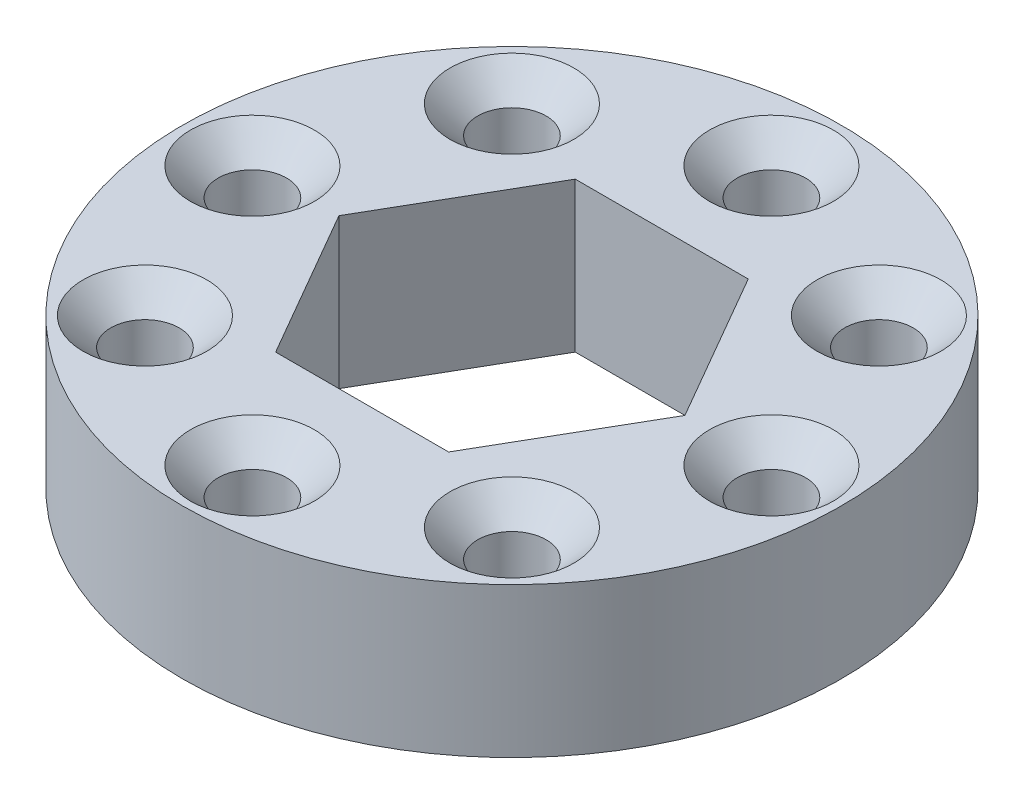
ISO-10303-21;
HEADER;
FILE_DESCRIPTION(('STEP AP214'),'2;1');
FILE_NAME('part.step','',(''),(''),'','','');
FILE_SCHEMA(('AUTOMOTIVE_DESIGN { 1 0 10303 214 1 1 1 1 }'));
ENDSEC;
DATA;
#1=APPLICATION_CONTEXT('core data for automotive mechanical design processes');
#2=APPLICATION_PROTOCOL_DEFINITION('international standard','automotive_design',2000,#1);
#3=PRODUCT_CONTEXT('',#1,'mechanical');
#4=PRODUCT('Part','Part','',(#3));
#5=PRODUCT_RELATED_PRODUCT_CATEGORY('part','',(#4));
#6=PRODUCT_DEFINITION_FORMATION('','',#4);
#7=PRODUCT_DEFINITION_CONTEXT('part definition',#1,'design');
#8=PRODUCT_DEFINITION('design','',#6,#7);
#9=PRODUCT_DEFINITION_SHAPE('','',#8);
#10=(LENGTH_UNIT() NAMED_UNIT(*) SI_UNIT(.MILLI.,.METRE.));
#11=(NAMED_UNIT(*) PLANE_ANGLE_UNIT() SI_UNIT($,.RADIAN.));
#12=(NAMED_UNIT(*) SI_UNIT($,.STERADIAN.) SOLID_ANGLE_UNIT());
#13=UNCERTAINTY_MEASURE_WITH_UNIT(LENGTH_MEASURE(1.E-05),#10,'distance_accuracy_value','');
#14=(GEOMETRIC_REPRESENTATION_CONTEXT(3) GLOBAL_UNCERTAINTY_ASSIGNED_CONTEXT((#13)) GLOBAL_UNIT_ASSIGNED_CONTEXT((#10,
#11,#12)) REPRESENTATION_CONTEXT('',''));
#15=CARTESIAN_POINT('',(0.,0.,0.));
#16=DIRECTION('',(0.,0.,1.));
#17=DIRECTION('',(1.,0.,0.));
#18=AXIS2_PLACEMENT_3D('',#15,#16,#17);
#19=CARTESIAN_POINT('',(0.,3.175,0.));
#20=DIRECTION('',(0.,1.,0.));
#21=DIRECTION('',(0.,0.,1.));
#22=AXIS2_PLACEMENT_3D('',#19,#20,#21);
#23=PLANE('',#22);
#24=CARTESIAN_POINT('',(7.77817459305193,3.175,-7.77817459305212));
#25=DIRECTION('',(0.,1.,0.));
#26=DIRECTION('',(0.,0.,1.));
#27=AXIS2_PLACEMENT_3D('',#24,#25,#26);
#28=CIRCLE('',#27,2.625);
#29=CARTESIAN_POINT('',(7.77817459305193,3.175,-5.15317459305212));
#30=VERTEX_POINT('',#29);
#31=EDGE_CURVE('E335',#30,#30,#28,.T.);
#32=ORIENTED_EDGE('',*,*,#31,.F.);
#33=EDGE_LOOP('',(#32));
#34=FACE_BOUND('',#33,.T.);
#35=CARTESIAN_POINT('',(11.,3.175,-1.15218884181823E-13));
#36=DIRECTION('',(0.,1.,0.));
#37=DIRECTION('',(0.,0.,1.));
#38=AXIS2_PLACEMENT_3D('',#35,#36,#37);
#39=CIRCLE('',#38,2.625);
#40=CARTESIAN_POINT('',(11.,3.175,2.62499999999989));
#41=VERTEX_POINT('',#40);
#42=EDGE_CURVE('E342',#41,#41,#39,.T.);
#43=ORIENTED_EDGE('',*,*,#42,.F.);
#44=EDGE_LOOP('',(#43));
#45=FACE_BOUND('',#44,.T.);
#46=CARTESIAN_POINT('',(7.77817459305209,3.175,7.77817459305195));
#47=DIRECTION('',(0.,1.,0.));
#48=DIRECTION('',(0.,0.,1.));
#49=AXIS2_PLACEMENT_3D('',#46,#47,#48);
#50=CIRCLE('',#49,2.625);
#51=CARTESIAN_POINT('',(7.77817459305209,3.175,10.403174593052));
#52=VERTEX_POINT('',#51);
#53=EDGE_CURVE('E351',#52,#52,#50,.T.);
#54=ORIENTED_EDGE('',*,*,#53,.F.);
#55=EDGE_LOOP('',(#54));
#56=FACE_BOUND('',#55,.T.);
#57=CARTESIAN_POINT('',(0.,3.175,11.));
#58=DIRECTION('',(0.,1.,0.));
#59=DIRECTION('',(0.,0.,1.));
#60=AXIS2_PLACEMENT_3D('',#57,#58,#59);
#61=CIRCLE('',#60,2.625);
#62=CARTESIAN_POINT('',(0.,3.175,13.625));
#63=VERTEX_POINT('',#62);
#64=EDGE_CURVE('E360',#63,#63,#61,.T.);
#65=ORIENTED_EDGE('',*,*,#64,.F.);
#66=EDGE_LOOP('',(#65));
#67=FACE_BOUND('',#66,.T.);
#68=CARTESIAN_POINT('',(-7.77817459305198,3.175,7.77817459305206));
#69=DIRECTION('',(0.,1.,0.));
#70=DIRECTION('',(0.,0.,1.));
#71=AXIS2_PLACEMENT_3D('',#68,#69,#70);
#72=CIRCLE('',#71,2.625);
#73=CARTESIAN_POINT('',(-7.77817459305198,3.175,10.4031745930521));
#74=VERTEX_POINT('',#73);
#75=EDGE_CURVE('E369',#74,#74,#72,.T.);
#76=ORIENTED_EDGE('',*,*,#75,.F.);
#77=EDGE_LOOP('',(#76));
#78=FACE_BOUND('',#77,.T.);
#79=CARTESIAN_POINT('',(-11.,3.175,0.));
#80=DIRECTION('',(0.,1.,0.));
#81=DIRECTION('',(0.,0.,1.));
#82=AXIS2_PLACEMENT_3D('',#79,#80,#81);
#83=CIRCLE('',#82,2.625);
#84=CARTESIAN_POINT('',(-11.,3.175,2.62500000000004));
#85=VERTEX_POINT('',#84);
#86=EDGE_CURVE('E378',#85,#85,#83,.T.);
#87=ORIENTED_EDGE('',*,*,#86,.F.);
#88=EDGE_LOOP('',(#87));
#89=FACE_BOUND('',#88,.T.);
#90=CARTESIAN_POINT('',(-7.77817459305204,3.175,-7.77817459305201));
#91=DIRECTION('',(0.,1.,0.));
#92=DIRECTION('',(0.,0.,1.));
#93=AXIS2_PLACEMENT_3D('',#90,#91,#92);
#94=CIRCLE('',#93,2.625);
#95=CARTESIAN_POINT('',(-7.77817459305204,3.175,-5.15317459305201));
#96=VERTEX_POINT('',#95);
#97=EDGE_CURVE('E387',#96,#96,#94,.T.);
#98=ORIENTED_EDGE('',*,*,#97,.F.);
#99=EDGE_LOOP('',(#98));
#100=FACE_BOUND('',#99,.T.);
#101=CARTESIAN_POINT('',(0.,3.175,-11.));
#102=DIRECTION('',(0.,1.,0.));
#103=DIRECTION('',(0.,0.,1.));
#104=AXIS2_PLACEMENT_3D('',#101,#102,#103);
#105=CIRCLE('',#104,2.625);
#106=CARTESIAN_POINT('',(0.,3.175,-8.375));
#107=VERTEX_POINT('',#106);
#108=EDGE_CURVE('E396',#107,#107,#105,.T.);
#109=ORIENTED_EDGE('',*,*,#108,.F.);
#110=EDGE_LOOP('',(#109));
#111=FACE_BOUND('',#110,.T.);
#112=CARTESIAN_POINT('',(0.,3.175,0.));
#113=DIRECTION('',(0.,1.,0.));
#114=DIRECTION('',(0.,0.,1.));
#115=AXIS2_PLACEMENT_3D('',#112,#113,#114);
#116=CIRCLE('',#115,13.97);
#117=CARTESIAN_POINT('',(0.,3.175,13.97));
#118=VERTEX_POINT('',#117);
#119=EDGE_CURVE('E11',#118,#118,#116,.T.);
#120=ORIENTED_EDGE('',*,*,#119,.T.);
#121=EDGE_LOOP('',(#120));
#122=FACE_BOUND('',#121,.T.);
#123=DIRECTION('',(-1.,0.,0.));
#124=VECTOR('',#123,1.);
#125=CARTESIAN_POINT('',(3.66617420935412,3.175,-6.35));
#126=LINE('',#125,#124);
#127=CARTESIAN_POINT('',(3.66617420935412,3.175,-6.35));
#128=VERTEX_POINT('',#127);
#129=CARTESIAN_POINT('',(-3.66617420935412,3.175,-6.35));
#130=VERTEX_POINT('',#129);
#131=EDGE_CURVE('E100',#128,#130,#126,.T.);
#132=ORIENTED_EDGE('',*,*,#131,.F.);
#133=DIRECTION('',(-0.5,0.,-0.866025403784439));
#134=VECTOR('',#133,1.);
#135=CARTESIAN_POINT('',(7.33234841870825,3.175,0.));
#136=LINE('',#135,#134);
#137=CARTESIAN_POINT('',(7.33234841870825,3.175,0.));
#138=VERTEX_POINT('',#137);
#139=EDGE_CURVE('E92',#138,#128,#136,.T.);
#140=ORIENTED_EDGE('',*,*,#139,.F.);
#141=DIRECTION('',(0.5,0.,-0.866025403784439));
#142=VECTOR('',#141,1.);
#143=CARTESIAN_POINT('',(3.66617420935413,3.175,6.35));
#144=LINE('',#143,#142);
#145=CARTESIAN_POINT('',(3.66617420935413,3.175,6.35));
#146=VERTEX_POINT('',#145);
#147=EDGE_CURVE('E121',#146,#138,#144,.T.);
#148=ORIENTED_EDGE('',*,*,#147,.F.);
#149=DIRECTION('',(1.,0.,0.));
#150=VECTOR('',#149,1.);
#151=CARTESIAN_POINT('',(-3.66617420935412,3.175,6.35));
#152=LINE('',#151,#150);
#153=CARTESIAN_POINT('',(-3.66617420935412,3.175,6.35));
#154=VERTEX_POINT('',#153);
#155=EDGE_CURVE('E119',#154,#146,#152,.T.);
#156=ORIENTED_EDGE('',*,*,#155,.F.);
#157=DIRECTION('',(0.5,0.,0.866025403784438));
#158=VECTOR('',#157,1.);
#159=CARTESIAN_POINT('',(-7.33234841870824,3.175,0.));
#160=LINE('',#159,#158);
#161=CARTESIAN_POINT('',(-7.33234841870824,3.175,0.));
#162=VERTEX_POINT('',#161);
#163=EDGE_CURVE('E114',#162,#154,#160,.T.);
#164=ORIENTED_EDGE('',*,*,#163,.F.);
#165=DIRECTION('',(-0.499999999999999,0.,0.866025403784439));
#166=VECTOR('',#165,1.);
#167=CARTESIAN_POINT('',(-3.66617420935412,3.175,-6.35));
#168=LINE('',#167,#166);
#169=EDGE_CURVE('E112',#130,#162,#168,.T.);
#170=ORIENTED_EDGE('',*,*,#169,.F.);
#171=EDGE_LOOP('',(#132,#140,#148,#156,#164,#170));
#172=FACE_BOUND('',#171,.T.);
#173=ADVANCED_FACE('F39',(#34,#45,#56,#67,#78,#89,#100,#111,#122,#172),#23,.T.);
#174=CARTESIAN_POINT('',(0.,-3.175,0.));
#175=DIRECTION('',(0.,1.,0.));
#176=DIRECTION('',(0.,0.,1.));
#177=AXIS2_PLACEMENT_3D('',#174,#175,#176);
#178=PLANE('',#177);
#179=CARTESIAN_POINT('',(7.77817459305193,-3.17499999999999,-7.77817459305212));
#180=DIRECTION('',(0.,1.,0.));
#181=DIRECTION('',(0.,0.,1.));
#182=AXIS2_PLACEMENT_3D('',#179,#180,#181);
#183=CIRCLE('',#182,1.44999999999999);
#184=CARTESIAN_POINT('',(7.77817459305193,-3.17499999999999,-6.32817459305213));
#185=VERTEX_POINT('',#184);
#186=EDGE_CURVE('E337',#185,#185,#183,.T.);
#187=ORIENTED_EDGE('',*,*,#186,.T.);
#188=EDGE_LOOP('',(#187));
#189=FACE_BOUND('',#188,.T.);
#190=CARTESIAN_POINT('',(11.,-3.17499999999999,-1.15218884181823E-13));
#191=DIRECTION('',(0.,1.,0.));
#192=DIRECTION('',(0.,0.,1.));
#193=AXIS2_PLACEMENT_3D('',#190,#191,#192);
#194=CIRCLE('',#193,1.44999999999999);
#195=CARTESIAN_POINT('',(11.,-3.17499999999999,1.44999999999987));
#196=VERTEX_POINT('',#195);
#197=EDGE_CURVE('E348',#196,#196,#194,.T.);
#198=ORIENTED_EDGE('',*,*,#197,.T.);
#199=EDGE_LOOP('',(#198));
#200=FACE_BOUND('',#199,.T.);
#201=CARTESIAN_POINT('',(7.77817459305209,-3.17499999999999,7.77817459305195));
#202=DIRECTION('',(0.,1.,0.));
#203=DIRECTION('',(0.,0.,1.));
#204=AXIS2_PLACEMENT_3D('',#201,#202,#203);
#205=CIRCLE('',#204,1.44999999999999);
#206=CARTESIAN_POINT('',(7.77817459305209,-3.17499999999999,9.22817459305194));
#207=VERTEX_POINT('',#206);
#208=EDGE_CURVE('E357',#207,#207,#205,.T.);
#209=ORIENTED_EDGE('',*,*,#208,.T.);
#210=EDGE_LOOP('',(#209));
#211=FACE_BOUND('',#210,.T.);
#212=CARTESIAN_POINT('',(0.,-3.17499999999999,11.));
#213=DIRECTION('',(0.,1.,0.));
#214=DIRECTION('',(0.,0.,1.));
#215=AXIS2_PLACEMENT_3D('',#212,#213,#214);
#216=CIRCLE('',#215,1.44999999999999);
#217=CARTESIAN_POINT('',(0.,-3.17499999999999,12.45));
#218=VERTEX_POINT('',#217);
#219=EDGE_CURVE('E366',#218,#218,#216,.T.);
#220=ORIENTED_EDGE('',*,*,#219,.T.);
#221=EDGE_LOOP('',(#220));
#222=FACE_BOUND('',#221,.T.);
#223=CARTESIAN_POINT('',(-7.77817459305198,-3.17499999999999,7.77817459305206));
#224=DIRECTION('',(0.,1.,0.));
#225=DIRECTION('',(0.,0.,1.));
#226=AXIS2_PLACEMENT_3D('',#223,#224,#225);
#227=CIRCLE('',#226,1.44999999999999);
#228=CARTESIAN_POINT('',(-7.77817459305198,-3.17499999999999,9.22817459305205));
#229=VERTEX_POINT('',#228);
#230=EDGE_CURVE('E375',#229,#229,#227,.T.);
#231=ORIENTED_EDGE('',*,*,#230,.T.);
#232=EDGE_LOOP('',(#231));
#233=FACE_BOUND('',#232,.T.);
#234=CARTESIAN_POINT('',(-11.,-3.17499999999999,0.));
#235=DIRECTION('',(0.,1.,0.));
#236=DIRECTION('',(0.,0.,1.));
#237=AXIS2_PLACEMENT_3D('',#234,#235,#236);
#238=CIRCLE('',#237,1.44999999999999);
#239=CARTESIAN_POINT('',(-11.,-3.17499999999999,1.45000000000002));
#240=VERTEX_POINT('',#239);
#241=EDGE_CURVE('E384',#240,#240,#238,.T.);
#242=ORIENTED_EDGE('',*,*,#241,.T.);
#243=EDGE_LOOP('',(#242));
#244=FACE_BOUND('',#243,.T.);
#245=CARTESIAN_POINT('',(-7.77817459305204,-3.17499999999999,-7.77817459305201));
#246=DIRECTION('',(0.,1.,0.));
#247=DIRECTION('',(0.,0.,1.));
#248=AXIS2_PLACEMENT_3D('',#245,#246,#247);
#249=CIRCLE('',#248,1.44999999999999);
#250=CARTESIAN_POINT('',(-7.77817459305204,-3.17499999999999,-6.32817459305202));
#251=VERTEX_POINT('',#250);
#252=EDGE_CURVE('E393',#251,#251,#249,.T.);
#253=ORIENTED_EDGE('',*,*,#252,.T.);
#254=EDGE_LOOP('',(#253));
#255=FACE_BOUND('',#254,.T.);
#256=CARTESIAN_POINT('',(0.,-3.17499999999999,-11.));
#257=DIRECTION('',(0.,1.,0.));
#258=DIRECTION('',(0.,0.,1.));
#259=AXIS2_PLACEMENT_3D('',#256,#257,#258);
#260=CIRCLE('',#259,1.44999999999999);
#261=CARTESIAN_POINT('',(0.,-3.17499999999999,-9.55000000000001));
#262=VERTEX_POINT('',#261);
#263=EDGE_CURVE('E124',#262,#262,#260,.T.);
#264=ORIENTED_EDGE('',*,*,#263,.T.);
#265=EDGE_LOOP('',(#264));
#266=FACE_BOUND('',#265,.T.);
#267=CARTESIAN_POINT('',(0.,-3.175,0.));
#268=DIRECTION('',(0.,1.,0.));
#269=DIRECTION('',(0.,0.,1.));
#270=AXIS2_PLACEMENT_3D('',#267,#268,#269);
#271=CIRCLE('',#270,13.97);
#272=CARTESIAN_POINT('',(0.,-3.175,13.97));
#273=VERTEX_POINT('',#272);
#274=EDGE_CURVE('E43',#273,#273,#271,.T.);
#275=ORIENTED_EDGE('',*,*,#274,.F.);
#276=EDGE_LOOP('',(#275));
#277=FACE_BOUND('',#276,.T.);
#278=DIRECTION('',(-0.5,0.,-0.866025403784439));
#279=VECTOR('',#278,1.);
#280=CARTESIAN_POINT('',(7.33234841870825,-3.175,0.));
#281=LINE('',#280,#279);
#282=CARTESIAN_POINT('',(7.33234841870825,-3.175,0.));
#283=VERTEX_POINT('',#282);
#284=CARTESIAN_POINT('',(3.66617420935412,-3.175,-6.35));
#285=VERTEX_POINT('',#284);
#286=EDGE_CURVE('E62',#283,#285,#281,.T.);
#287=ORIENTED_EDGE('',*,*,#286,.T.);
#288=DIRECTION('',(-1.,0.,0.));
#289=VECTOR('',#288,1.);
#290=CARTESIAN_POINT('',(3.66617420935412,-3.175,-6.35));
#291=LINE('',#290,#289);
#292=CARTESIAN_POINT('',(-3.66617420935412,-3.175,-6.35));
#293=VERTEX_POINT('',#292);
#294=EDGE_CURVE('E107',#285,#293,#291,.T.);
#295=ORIENTED_EDGE('',*,*,#294,.T.);
#296=DIRECTION('',(-0.499999999999999,0.,0.866025403784439));
#297=VECTOR('',#296,1.);
#298=CARTESIAN_POINT('',(-3.66617420935412,-3.175,-6.35));
#299=LINE('',#298,#297);
#300=CARTESIAN_POINT('',(-7.33234841870824,-3.175,0.));
#301=VERTEX_POINT('',#300);
#302=EDGE_CURVE('E126',#293,#301,#299,.T.);
#303=ORIENTED_EDGE('',*,*,#302,.T.);
#304=DIRECTION('',(0.5,0.,0.866025403784438));
#305=VECTOR('',#304,1.);
#306=CARTESIAN_POINT('',(-7.33234841870824,-3.175,0.));
#307=LINE('',#306,#305);
#308=CARTESIAN_POINT('',(-3.66617420935412,-3.175,6.35));
#309=VERTEX_POINT('',#308);
#310=EDGE_CURVE('E129',#301,#309,#307,.T.);
#311=ORIENTED_EDGE('',*,*,#310,.T.);
#312=DIRECTION('',(1.,0.,0.));
#313=VECTOR('',#312,1.);
#314=CARTESIAN_POINT('',(-3.66617420935412,-3.175,6.35));
#315=LINE('',#314,#313);
#316=CARTESIAN_POINT('',(3.66617420935413,-3.175,6.35));
#317=VERTEX_POINT('',#316);
#318=EDGE_CURVE('E132',#309,#317,#315,.T.);
#319=ORIENTED_EDGE('',*,*,#318,.T.);
#320=DIRECTION('',(0.5,0.,-0.866025403784439));
#321=VECTOR('',#320,1.);
#322=CARTESIAN_POINT('',(3.66617420935413,-3.175,6.35));
#323=LINE('',#322,#321);
#324=EDGE_CURVE('E101',#317,#283,#323,.T.);
#325=ORIENTED_EDGE('',*,*,#324,.T.);
#326=EDGE_LOOP('',(#287,#295,#303,#311,#319,#325));
#327=FACE_BOUND('',#326,.T.);
#328=ADVANCED_FACE('F149',(#189,#200,#211,#222,#233,#244,#255,#266,#277,#327),#178,.F.);
#329=CARTESIAN_POINT('',(0.,3.175,0.));
#330=DIRECTION('',(0.,-1.,0.));
#331=DIRECTION('',(0.,0.,-1.));
#332=AXIS2_PLACEMENT_3D('',#329,#330,#331);
#333=CYLINDRICAL_SURFACE('',#332,13.97);
#334=ORIENTED_EDGE('',*,*,#119,.F.);
#335=EDGE_LOOP('',(#334));
#336=FACE_BOUND('',#335,.T.);
#337=ORIENTED_EDGE('',*,*,#274,.T.);
#338=EDGE_LOOP('',(#337));
#339=FACE_BOUND('',#338,.T.);
#340=ADVANCED_FACE('F41',(#336,#339),#333,.T.);
#341=CARTESIAN_POINT('',(7.33234841870825,3.175,0.));
#342=DIRECTION('',(-0.866025403784439,0.,0.5));
#343=DIRECTION('',(0.5,0.,0.866025403784439));
#344=AXIS2_PLACEMENT_3D('',#341,#342,#343);
#345=PLANE('',#344);
#346=ORIENTED_EDGE('',*,*,#286,.F.);
#347=DIRECTION('',(0.,-1.,0.));
#348=VECTOR('',#347,1.);
#349=CARTESIAN_POINT('',(7.33234841870825,3.175,0.));
#350=LINE('',#349,#348);
#351=EDGE_CURVE('E96',#138,#283,#350,.T.);
#352=ORIENTED_EDGE('',*,*,#351,.F.);
#353=ORIENTED_EDGE('',*,*,#139,.T.);
#354=DIRECTION('',(0.,-1.,0.));
#355=VECTOR('',#354,1.);
#356=CARTESIAN_POINT('',(3.66617420935412,3.175,-6.35));
#357=LINE('',#356,#355);
#358=EDGE_CURVE('E95',#128,#285,#357,.T.);
#359=ORIENTED_EDGE('',*,*,#358,.T.);
#360=EDGE_LOOP('',(#346,#352,#353,#359));
#361=FACE_BOUND('',#360,.T.);
#362=ADVANCED_FACE('F94',(#361),#345,.T.);
#363=CARTESIAN_POINT('',(3.66617420935412,3.175,-6.35));
#364=DIRECTION('',(0.,0.,1.));
#365=DIRECTION('',(1.,0.,0.));
#366=AXIS2_PLACEMENT_3D('',#363,#364,#365);
#367=PLANE('',#366);
#368=ORIENTED_EDGE('',*,*,#294,.F.);
#369=ORIENTED_EDGE('',*,*,#358,.F.);
#370=ORIENTED_EDGE('',*,*,#131,.T.);
#371=DIRECTION('',(0.,-1.,0.));
#372=VECTOR('',#371,1.);
#373=CARTESIAN_POINT('',(-3.66617420935412,3.175,-6.35));
#374=LINE('',#373,#372);
#375=EDGE_CURVE('E108',#130,#293,#374,.T.);
#376=ORIENTED_EDGE('',*,*,#375,.T.);
#377=EDGE_LOOP('',(#368,#369,#370,#376));
#378=FACE_BOUND('',#377,.T.);
#379=ADVANCED_FACE('F104',(#378),#367,.T.);
#380=CARTESIAN_POINT('',(-3.66617420935412,3.175,-6.35));
#381=DIRECTION('',(0.866025403784439,0.,0.499999999999999));
#382=DIRECTION('',(0.5,0.,-0.866025403784439));
#383=AXIS2_PLACEMENT_3D('',#380,#381,#382);
#384=PLANE('',#383);
#385=ORIENTED_EDGE('',*,*,#302,.F.);
#386=ORIENTED_EDGE('',*,*,#375,.F.);
#387=ORIENTED_EDGE('',*,*,#169,.T.);
#388=DIRECTION('',(0.,-1.,0.));
#389=VECTOR('',#388,1.);
#390=CARTESIAN_POINT('',(-7.33234841870824,3.175,0.));
#391=LINE('',#390,#389);
#392=EDGE_CURVE('E141',#162,#301,#391,.T.);
#393=ORIENTED_EDGE('',*,*,#392,.T.);
#394=EDGE_LOOP('',(#385,#386,#387,#393));
#395=FACE_BOUND('',#394,.T.);
#396=ADVANCED_FACE('F145',(#395),#384,.T.);
#397=CARTESIAN_POINT('',(-7.33234841870824,3.175,0.));
#398=DIRECTION('',(0.866025403784439,0.,-0.5));
#399=DIRECTION('',(-0.5,0.,-0.866025403784439));
#400=AXIS2_PLACEMENT_3D('',#397,#398,#399);
#401=PLANE('',#400);
#402=ORIENTED_EDGE('',*,*,#310,.F.);
#403=ORIENTED_EDGE('',*,*,#392,.F.);
#404=ORIENTED_EDGE('',*,*,#163,.T.);
#405=DIRECTION('',(0.,-1.,0.));
#406=VECTOR('',#405,1.);
#407=CARTESIAN_POINT('',(-3.66617420935412,3.175,6.35));
#408=LINE('',#407,#406);
#409=EDGE_CURVE('E139',#154,#309,#408,.T.);
#410=ORIENTED_EDGE('',*,*,#409,.T.);
#411=EDGE_LOOP('',(#402,#403,#404,#410));
#412=FACE_BOUND('',#411,.T.);
#413=ADVANCED_FACE('F157',(#412),#401,.T.);
#414=CARTESIAN_POINT('',(-3.66617420935412,3.175,6.35));
#415=DIRECTION('',(0.,0.,-1.));
#416=DIRECTION('',(-1.,0.,0.));
#417=AXIS2_PLACEMENT_3D('',#414,#415,#416);
#418=PLANE('',#417);
#419=ORIENTED_EDGE('',*,*,#318,.F.);
#420=ORIENTED_EDGE('',*,*,#409,.F.);
#421=ORIENTED_EDGE('',*,*,#155,.T.);
#422=DIRECTION('',(0.,-1.,0.));
#423=VECTOR('',#422,1.);
#424=CARTESIAN_POINT('',(3.66617420935413,3.175,6.35));
#425=LINE('',#424,#423);
#426=EDGE_CURVE('E54',#146,#317,#425,.T.);
#427=ORIENTED_EDGE('',*,*,#426,.T.);
#428=EDGE_LOOP('',(#419,#420,#421,#427));
#429=FACE_BOUND('',#428,.T.);
#430=ADVANCED_FACE('F155',(#429),#418,.T.);
#431=CARTESIAN_POINT('',(3.66617420935413,3.175,6.35));
#432=DIRECTION('',(-0.866025403784439,0.,-0.5));
#433=DIRECTION('',(-0.5,0.,0.866025403784439));
#434=AXIS2_PLACEMENT_3D('',#431,#432,#433);
#435=PLANE('',#434);
#436=ORIENTED_EDGE('',*,*,#324,.F.);
#437=ORIENTED_EDGE('',*,*,#426,.F.);
#438=ORIENTED_EDGE('',*,*,#147,.T.);
#439=ORIENTED_EDGE('',*,*,#351,.T.);
#440=EDGE_LOOP('',(#436,#437,#438,#439));
#441=FACE_BOUND('',#440,.T.);
#442=ADVANCED_FACE('F151',(#441),#435,.T.);
#443=CARTESIAN_POINT('',(0.,3.175,-11.));
#444=DIRECTION('',(0.,1.,0.));
#445=DIRECTION('',(0.,0.,1.));
#446=AXIS2_PLACEMENT_3D('',#443,#444,#445);
#447=CYLINDRICAL_SURFACE('',#446,1.44999999999999);
#448=ORIENTED_EDGE('',*,*,#263,.F.);
#449=EDGE_LOOP('',(#448));
#450=FACE_BOUND('',#449,.T.);
#451=CARTESIAN_POINT('',(0.,2.,-11.));
#452=DIRECTION('',(0.,1.,0.));
#453=DIRECTION('',(0.,0.,1.));
#454=AXIS2_PLACEMENT_3D('',#451,#452,#453);
#455=CIRCLE('',#454,1.45);
#456=CARTESIAN_POINT('',(0.,2.,-9.55));
#457=VERTEX_POINT('',#456);
#458=EDGE_CURVE('E399',#457,#457,#455,.T.);
#459=ORIENTED_EDGE('',*,*,#458,.T.);
#460=EDGE_LOOP('',(#459));
#461=FACE_BOUND('',#460,.T.);
#462=ADVANCED_FACE('F202',(#450,#461),#447,.F.);
#463=CARTESIAN_POINT('',(0.,3.175,-11.));
#464=DIRECTION('',(0.,1.,0.));
#465=DIRECTION('',(0.,0.,1.));
#466=AXIS2_PLACEMENT_3D('',#463,#464,#465);
#467=CONICAL_SURFACE('',#466,2.625,0.785398163397449);
#468=ORIENTED_EDGE('',*,*,#458,.F.);
#469=EDGE_LOOP('',(#468));
#470=FACE_BOUND('',#469,.T.);
#471=ORIENTED_EDGE('',*,*,#108,.T.);
#472=EDGE_LOOP('',(#471));
#473=FACE_BOUND('',#472,.T.);
#474=ADVANCED_FACE('F209',(#470,#473),#467,.F.);
#475=CARTESIAN_POINT('',(-7.77817459305204,3.175,-7.77817459305201));
#476=DIRECTION('',(0.,1.,0.));
#477=DIRECTION('',(0.,0.,1.));
#478=AXIS2_PLACEMENT_3D('',#475,#476,#477);
#479=CYLINDRICAL_SURFACE('',#478,1.44999999999999);
#480=ORIENTED_EDGE('',*,*,#252,.F.);
#481=EDGE_LOOP('',(#480));
#482=FACE_BOUND('',#481,.T.);
#483=CARTESIAN_POINT('',(-7.77817459305204,2.,-7.77817459305201));
#484=DIRECTION('',(0.,1.,0.));
#485=DIRECTION('',(0.,0.,1.));
#486=AXIS2_PLACEMENT_3D('',#483,#484,#485);
#487=CIRCLE('',#486,1.45);
#488=CARTESIAN_POINT('',(-7.77817459305204,2.,-6.32817459305201));
#489=VERTEX_POINT('',#488);
#490=EDGE_CURVE('E390',#489,#489,#487,.T.);
#491=ORIENTED_EDGE('',*,*,#490,.T.);
#492=EDGE_LOOP('',(#491));
#493=FACE_BOUND('',#492,.T.);
#494=ADVANCED_FACE('F216',(#482,#493),#479,.F.);
#495=CARTESIAN_POINT('',(-7.77817459305204,3.175,-7.77817459305201));
#496=DIRECTION('',(0.,1.,0.));
#497=DIRECTION('',(0.,0.,1.));
#498=AXIS2_PLACEMENT_3D('',#495,#496,#497);
#499=CONICAL_SURFACE('',#498,2.625,0.785398163397449);
#500=ORIENTED_EDGE('',*,*,#490,.F.);
#501=EDGE_LOOP('',(#500));
#502=FACE_BOUND('',#501,.T.);
#503=ORIENTED_EDGE('',*,*,#97,.T.);
#504=EDGE_LOOP('',(#503));
#505=FACE_BOUND('',#504,.T.);
#506=ADVANCED_FACE('F224',(#502,#505),#499,.F.);
#507=CARTESIAN_POINT('',(-11.,3.175,0.));
#508=DIRECTION('',(0.,1.,0.));
#509=DIRECTION('',(0.,0.,1.));
#510=AXIS2_PLACEMENT_3D('',#507,#508,#509);
#511=CYLINDRICAL_SURFACE('',#510,1.44999999999999);
#512=ORIENTED_EDGE('',*,*,#241,.F.);
#513=EDGE_LOOP('',(#512));
#514=FACE_BOUND('',#513,.T.);
#515=CARTESIAN_POINT('',(-11.,2.,0.));
#516=DIRECTION('',(0.,1.,0.));
#517=DIRECTION('',(0.,0.,1.));
#518=AXIS2_PLACEMENT_3D('',#515,#516,#517);
#519=CIRCLE('',#518,1.45);
#520=CARTESIAN_POINT('',(-11.,2.,1.45000000000004));
#521=VERTEX_POINT('',#520);
#522=EDGE_CURVE('E381',#521,#521,#519,.T.);
#523=ORIENTED_EDGE('',*,*,#522,.T.);
#524=EDGE_LOOP('',(#523));
#525=FACE_BOUND('',#524,.T.);
#526=ADVANCED_FACE('F232',(#514,#525),#511,.F.);
#527=CARTESIAN_POINT('',(-11.,3.175,0.));
#528=DIRECTION('',(0.,1.,0.));
#529=DIRECTION('',(0.,0.,1.));
#530=AXIS2_PLACEMENT_3D('',#527,#528,#529);
#531=CONICAL_SURFACE('',#530,2.625,0.785398163397449);
#532=ORIENTED_EDGE('',*,*,#522,.F.);
#533=EDGE_LOOP('',(#532));
#534=FACE_BOUND('',#533,.T.);
#535=ORIENTED_EDGE('',*,*,#86,.T.);
#536=EDGE_LOOP('',(#535));
#537=FACE_BOUND('',#536,.T.);
#538=ADVANCED_FACE('F240',(#534,#537),#531,.F.);
#539=CARTESIAN_POINT('',(-7.77817459305198,3.175,7.77817459305206));
#540=DIRECTION('',(0.,1.,0.));
#541=DIRECTION('',(0.,0.,1.));
#542=AXIS2_PLACEMENT_3D('',#539,#540,#541);
#543=CYLINDRICAL_SURFACE('',#542,1.44999999999999);
#544=ORIENTED_EDGE('',*,*,#230,.F.);
#545=EDGE_LOOP('',(#544));
#546=FACE_BOUND('',#545,.T.);
#547=CARTESIAN_POINT('',(-7.77817459305198,2.,7.77817459305206));
#548=DIRECTION('',(0.,1.,0.));
#549=DIRECTION('',(0.,0.,1.));
#550=AXIS2_PLACEMENT_3D('',#547,#548,#549);
#551=CIRCLE('',#550,1.45);
#552=CARTESIAN_POINT('',(-7.77817459305198,2.,9.22817459305206));
#553=VERTEX_POINT('',#552);
#554=EDGE_CURVE('E372',#553,#553,#551,.T.);
#555=ORIENTED_EDGE('',*,*,#554,.T.);
#556=EDGE_LOOP('',(#555));
#557=FACE_BOUND('',#556,.T.);
#558=ADVANCED_FACE('F248',(#546,#557),#543,.F.);
#559=CARTESIAN_POINT('',(-7.77817459305198,3.175,7.77817459305206));
#560=DIRECTION('',(0.,1.,0.));
#561=DIRECTION('',(0.,0.,1.));
#562=AXIS2_PLACEMENT_3D('',#559,#560,#561);
#563=CONICAL_SURFACE('',#562,2.625,0.785398163397449);
#564=ORIENTED_EDGE('',*,*,#554,.F.);
#565=EDGE_LOOP('',(#564));
#566=FACE_BOUND('',#565,.T.);
#567=ORIENTED_EDGE('',*,*,#75,.T.);
#568=EDGE_LOOP('',(#567));
#569=FACE_BOUND('',#568,.T.);
#570=ADVANCED_FACE('F256',(#566,#569),#563,.F.);
#571=CARTESIAN_POINT('',(0.,3.175,11.));
#572=DIRECTION('',(0.,1.,0.));
#573=DIRECTION('',(0.,0.,1.));
#574=AXIS2_PLACEMENT_3D('',#571,#572,#573);
#575=CYLINDRICAL_SURFACE('',#574,1.44999999999999);
#576=ORIENTED_EDGE('',*,*,#219,.F.);
#577=EDGE_LOOP('',(#576));
#578=FACE_BOUND('',#577,.T.);
#579=CARTESIAN_POINT('',(0.,2.,11.));
#580=DIRECTION('',(0.,1.,0.));
#581=DIRECTION('',(0.,0.,1.));
#582=AXIS2_PLACEMENT_3D('',#579,#580,#581);
#583=CIRCLE('',#582,1.45);
#584=CARTESIAN_POINT('',(0.,2.,12.45));
#585=VERTEX_POINT('',#584);
#586=EDGE_CURVE('E363',#585,#585,#583,.T.);
#587=ORIENTED_EDGE('',*,*,#586,.T.);
#588=EDGE_LOOP('',(#587));
#589=FACE_BOUND('',#588,.T.);
#590=ADVANCED_FACE('F264',(#578,#589),#575,.F.);
#591=CARTESIAN_POINT('',(0.,3.175,11.));
#592=DIRECTION('',(0.,1.,0.));
#593=DIRECTION('',(0.,0.,1.));
#594=AXIS2_PLACEMENT_3D('',#591,#592,#593);
#595=CONICAL_SURFACE('',#594,2.625,0.785398163397449);
#596=ORIENTED_EDGE('',*,*,#586,.F.);
#597=EDGE_LOOP('',(#596));
#598=FACE_BOUND('',#597,.T.);
#599=ORIENTED_EDGE('',*,*,#64,.T.);
#600=EDGE_LOOP('',(#599));
#601=FACE_BOUND('',#600,.T.);
#602=ADVANCED_FACE('F272',(#598,#601),#595,.F.);
#603=CARTESIAN_POINT('',(7.77817459305209,3.175,7.77817459305195));
#604=DIRECTION('',(0.,1.,0.));
#605=DIRECTION('',(0.,0.,1.));
#606=AXIS2_PLACEMENT_3D('',#603,#604,#605);
#607=CYLINDRICAL_SURFACE('',#606,1.44999999999999);
#608=ORIENTED_EDGE('',*,*,#208,.F.);
#609=EDGE_LOOP('',(#608));
#610=FACE_BOUND('',#609,.T.);
#611=CARTESIAN_POINT('',(7.77817459305209,2.,7.77817459305195));
#612=DIRECTION('',(0.,1.,0.));
#613=DIRECTION('',(0.,0.,1.));
#614=AXIS2_PLACEMENT_3D('',#611,#612,#613);
#615=CIRCLE('',#614,1.45);
#616=CARTESIAN_POINT('',(7.77817459305209,2.,9.22817459305195));
#617=VERTEX_POINT('',#616);
#618=EDGE_CURVE('E354',#617,#617,#615,.T.);
#619=ORIENTED_EDGE('',*,*,#618,.T.);
#620=EDGE_LOOP('',(#619));
#621=FACE_BOUND('',#620,.T.);
#622=ADVANCED_FACE('F280',(#610,#621),#607,.F.);
#623=CARTESIAN_POINT('',(7.77817459305209,3.175,7.77817459305195));
#624=DIRECTION('',(0.,1.,0.));
#625=DIRECTION('',(0.,0.,1.));
#626=AXIS2_PLACEMENT_3D('',#623,#624,#625);
#627=CONICAL_SURFACE('',#626,2.625,0.785398163397449);
#628=ORIENTED_EDGE('',*,*,#618,.F.);
#629=EDGE_LOOP('',(#628));
#630=FACE_BOUND('',#629,.T.);
#631=ORIENTED_EDGE('',*,*,#53,.T.);
#632=EDGE_LOOP('',(#631));
#633=FACE_BOUND('',#632,.T.);
#634=ADVANCED_FACE('F288',(#630,#633),#627,.F.);
#635=CARTESIAN_POINT('',(11.,3.175,-1.15218884181823E-13));
#636=DIRECTION('',(0.,1.,0.));
#637=DIRECTION('',(0.,0.,1.));
#638=AXIS2_PLACEMENT_3D('',#635,#636,#637);
#639=CYLINDRICAL_SURFACE('',#638,1.44999999999999);
#640=ORIENTED_EDGE('',*,*,#197,.F.);
#641=EDGE_LOOP('',(#640));
#642=FACE_BOUND('',#641,.T.);
#643=CARTESIAN_POINT('',(11.,2.,-1.15218884181823E-13));
#644=DIRECTION('',(0.,1.,0.));
#645=DIRECTION('',(0.,0.,1.));
#646=AXIS2_PLACEMENT_3D('',#643,#644,#645);
#647=CIRCLE('',#646,1.45);
#648=CARTESIAN_POINT('',(11.,2.,1.44999999999988));
#649=VERTEX_POINT('',#648);
#650=EDGE_CURVE('E345',#649,#649,#647,.T.);
#651=ORIENTED_EDGE('',*,*,#650,.T.);
#652=EDGE_LOOP('',(#651));
#653=FACE_BOUND('',#652,.T.);
#654=ADVANCED_FACE('F296',(#642,#653),#639,.F.);
#655=CARTESIAN_POINT('',(11.,3.175,-1.15218884181823E-13));
#656=DIRECTION('',(0.,1.,0.));
#657=DIRECTION('',(0.,0.,1.));
#658=AXIS2_PLACEMENT_3D('',#655,#656,#657);
#659=CONICAL_SURFACE('',#658,2.625,0.785398163397449);
#660=ORIENTED_EDGE('',*,*,#650,.F.);
#661=EDGE_LOOP('',(#660));
#662=FACE_BOUND('',#661,.T.);
#663=ORIENTED_EDGE('',*,*,#42,.T.);
#664=EDGE_LOOP('',(#663));
#665=FACE_BOUND('',#664,.T.);
#666=ADVANCED_FACE('F304',(#662,#665),#659,.F.);
#667=CARTESIAN_POINT('',(7.77817459305193,3.175,-7.77817459305212));
#668=DIRECTION('',(0.,1.,0.));
#669=DIRECTION('',(0.,0.,1.));
#670=AXIS2_PLACEMENT_3D('',#667,#668,#669);
#671=CYLINDRICAL_SURFACE('',#670,1.44999999999999);
#672=ORIENTED_EDGE('',*,*,#186,.F.);
#673=EDGE_LOOP('',(#672));
#674=FACE_BOUND('',#673,.T.);
#675=CARTESIAN_POINT('',(7.77817459305193,2.,-7.77817459305212));
#676=DIRECTION('',(0.,1.,0.));
#677=DIRECTION('',(0.,0.,1.));
#678=AXIS2_PLACEMENT_3D('',#675,#676,#677);
#679=CIRCLE('',#678,1.45);
#680=CARTESIAN_POINT('',(7.77817459305193,2.,-6.32817459305212));
#681=VERTEX_POINT('',#680);
#682=EDGE_CURVE('E333',#681,#681,#679,.T.);
#683=ORIENTED_EDGE('',*,*,#682,.T.);
#684=EDGE_LOOP('',(#683));
#685=FACE_BOUND('',#684,.T.);
#686=ADVANCED_FACE('F312',(#674,#685),#671,.F.);
#687=CARTESIAN_POINT('',(7.77817459305193,3.175,-7.77817459305212));
#688=DIRECTION('',(0.,1.,0.));
#689=DIRECTION('',(0.,0.,1.));
#690=AXIS2_PLACEMENT_3D('',#687,#688,#689);
#691=CONICAL_SURFACE('',#690,2.625,0.785398163397449);
#692=ORIENTED_EDGE('',*,*,#682,.F.);
#693=EDGE_LOOP('',(#692));
#694=FACE_BOUND('',#693,.T.);
#695=ORIENTED_EDGE('',*,*,#31,.T.);
#696=EDGE_LOOP('',(#695));
#697=FACE_BOUND('',#696,.T.);
#698=ADVANCED_FACE('F320',(#694,#697),#691,.F.);
#699=CLOSED_SHELL('',(#173,#328,#340,#362,#379,#396,#413,#430,#442,#462,#474,#494,#506,#526,
#538,#558,#570,#590,#602,#622,#634,#654,#666,#686,#698));
#700=MANIFOLD_SOLID_BREP('B2',#699);
#701=ADVANCED_BREP_SHAPE_REPRESENTATION('',(#18,#700),#14);
#702=SHAPE_DEFINITION_REPRESENTATION(#9,#701);
ENDSEC;
END-ISO-10303-21;
